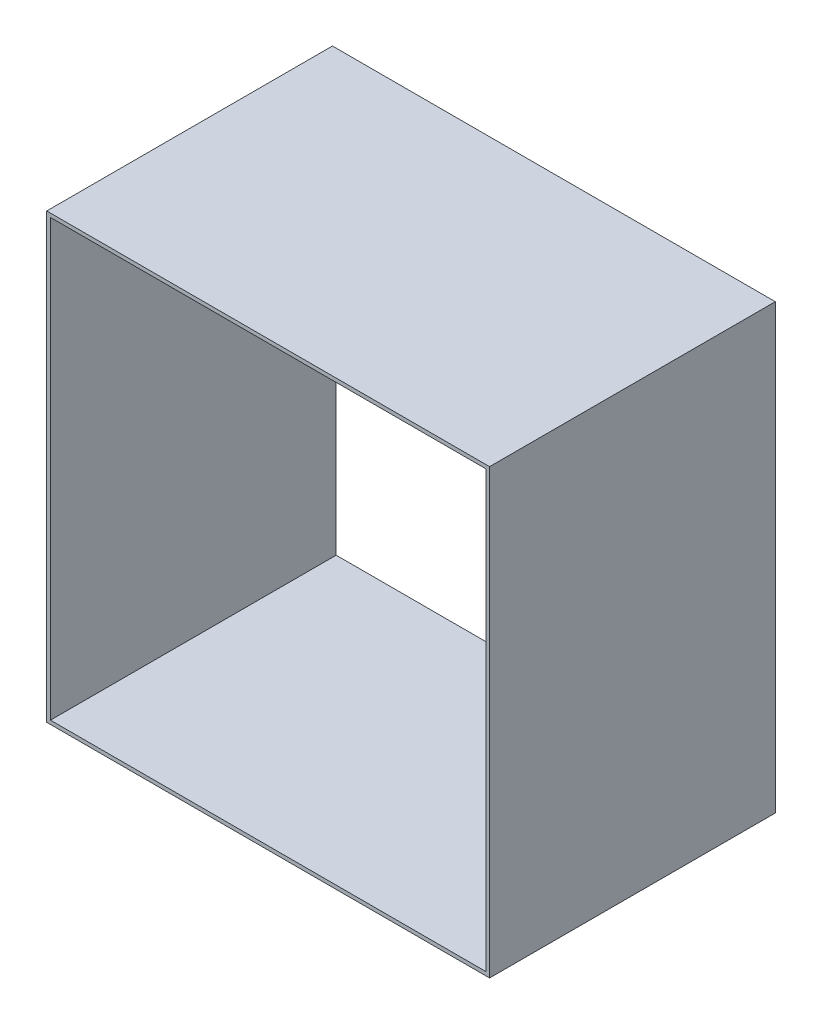
ISO-10303-21;
HEADER;
FILE_DESCRIPTION(('STEP AP214'),'2;1');
FILE_NAME('part.step','',(''),(''),'','','');
FILE_SCHEMA(('AUTOMOTIVE_DESIGN { 1 0 10303 214 1 1 1 1 }'));
ENDSEC;
DATA;
#1=APPLICATION_CONTEXT('core data for automotive mechanical design processes');
#2=APPLICATION_PROTOCOL_DEFINITION('international standard','automotive_design',2000,#1);
#3=PRODUCT_CONTEXT('',#1,'mechanical');
#4=PRODUCT('Part','Part','',(#3));
#5=PRODUCT_RELATED_PRODUCT_CATEGORY('part','',(#4));
#6=PRODUCT_DEFINITION_FORMATION('','',#4);
#7=PRODUCT_DEFINITION_CONTEXT('part definition',#1,'design');
#8=PRODUCT_DEFINITION('design','',#6,#7);
#9=PRODUCT_DEFINITION_SHAPE('','',#8);
#10=(LENGTH_UNIT() NAMED_UNIT(*) SI_UNIT(.MILLI.,.METRE.));
#11=(NAMED_UNIT(*) PLANE_ANGLE_UNIT() SI_UNIT($,.RADIAN.));
#12=(NAMED_UNIT(*) SI_UNIT($,.STERADIAN.) SOLID_ANGLE_UNIT());
#13=UNCERTAINTY_MEASURE_WITH_UNIT(LENGTH_MEASURE(1.E-05),#10,'distance_accuracy_value','');
#14=(GEOMETRIC_REPRESENTATION_CONTEXT(3) GLOBAL_UNCERTAINTY_ASSIGNED_CONTEXT((#13)) GLOBAL_UNIT_ASSIGNED_CONTEXT((#10,
#11,#12)) REPRESENTATION_CONTEXT('',''));
#15=CARTESIAN_POINT('',(0.,0.,0.));
#16=DIRECTION('',(0.,0.,1.));
#17=DIRECTION('',(1.,0.,0.));
#18=AXIS2_PLACEMENT_3D('',#15,#16,#17);
#19=CARTESIAN_POINT('',(0.,0.,420.));
#20=DIRECTION('',(0.,0.,-1.));
#21=DIRECTION('',(-1.,0.,0.));
#22=AXIS2_PLACEMENT_3D('',#19,#20,#21);
#23=PLANE('',#22);
#24=DIRECTION('',(0.,1.,0.));
#25=VECTOR('',#24,1.);
#26=CARTESIAN_POINT('',(325.5,-325.5,420.));
#27=LINE('',#26,#25);
#28=CARTESIAN_POINT('',(325.5,-325.5,420.));
#29=VERTEX_POINT('',#28);
#30=CARTESIAN_POINT('',(325.5,325.5,420.));
#31=VERTEX_POINT('',#30);
#32=EDGE_CURVE('E159',#29,#31,#27,.T.);
#33=ORIENTED_EDGE('',*,*,#32,.T.);
#34=DIRECTION('',(-1.,0.,0.));
#35=VECTOR('',#34,1.);
#36=CARTESIAN_POINT('',(-325.5,325.5,420.));
#37=LINE('',#36,#35);
#38=CARTESIAN_POINT('',(-325.5,325.5,420.));
#39=VERTEX_POINT('',#38);
#40=EDGE_CURVE('E163',#31,#39,#37,.T.);
#41=ORIENTED_EDGE('',*,*,#40,.T.);
#42=DIRECTION('',(0.,-1.,0.));
#43=VECTOR('',#42,1.);
#44=CARTESIAN_POINT('',(-325.5,-325.5,420.));
#45=LINE('',#44,#43);
#46=CARTESIAN_POINT('',(-325.5,-325.5,420.));
#47=VERTEX_POINT('',#46);
#48=EDGE_CURVE('E167',#39,#47,#45,.T.);
#49=ORIENTED_EDGE('',*,*,#48,.T.);
#50=DIRECTION('',(1.,0.,0.));
#51=VECTOR('',#50,1.);
#52=CARTESIAN_POINT('',(-325.5,-325.5,420.));
#53=LINE('',#52,#51);
#54=EDGE_CURVE('E170',#47,#29,#53,.T.);
#55=ORIENTED_EDGE('',*,*,#54,.T.);
#56=EDGE_LOOP('',(#33,#41,#49,#55));
#57=FACE_BOUND('',#56,.T.);
#58=DIRECTION('',(0.,1.,0.));
#59=VECTOR('',#58,1.);
#60=CARTESIAN_POINT('',(320.,-320.,420.));
#61=LINE('',#60,#59);
#62=CARTESIAN_POINT('',(320.,-320.,420.));
#63=VERTEX_POINT('',#62);
#64=CARTESIAN_POINT('',(320.,320.,420.));
#65=VERTEX_POINT('',#64);
#66=EDGE_CURVE('E111',#63,#65,#61,.T.);
#67=ORIENTED_EDGE('',*,*,#66,.F.);
#68=DIRECTION('',(1.,0.,0.));
#69=VECTOR('',#68,1.);
#70=CARTESIAN_POINT('',(-320.,-320.,420.));
#71=LINE('',#70,#69);
#72=CARTESIAN_POINT('',(-320.,-320.,420.));
#73=VERTEX_POINT('',#72);
#74=EDGE_CURVE('E137',#73,#63,#71,.T.);
#75=ORIENTED_EDGE('',*,*,#74,.F.);
#76=DIRECTION('',(0.,-1.,0.));
#77=VECTOR('',#76,1.);
#78=CARTESIAN_POINT('',(-320.,-320.,420.));
#79=LINE('',#78,#77);
#80=CARTESIAN_POINT('',(-320.,320.,420.));
#81=VERTEX_POINT('',#80);
#82=EDGE_CURVE('E133',#81,#73,#79,.T.);
#83=ORIENTED_EDGE('',*,*,#82,.F.);
#84=DIRECTION('',(-1.,0.,0.));
#85=VECTOR('',#84,1.);
#86=CARTESIAN_POINT('',(-320.,320.,420.));
#87=LINE('',#86,#85);
#88=EDGE_CURVE('E120',#65,#81,#87,.T.);
#89=ORIENTED_EDGE('',*,*,#88,.F.);
#90=EDGE_LOOP('',(#67,#75,#83,#89));
#91=FACE_BOUND('',#90,.T.);
#92=ADVANCED_FACE('F45',(#57,#91),#23,.F.);
#93=CARTESIAN_POINT('',(0.,0.,0.));
#94=DIRECTION('',(0.,0.,-1.));
#95=DIRECTION('',(-1.,0.,0.));
#96=AXIS2_PLACEMENT_3D('',#93,#94,#95);
#97=PLANE('',#96);
#98=DIRECTION('',(0.,1.,0.));
#99=VECTOR('',#98,1.);
#100=CARTESIAN_POINT('',(325.5,-325.5,0.));
#101=LINE('',#100,#99);
#102=CARTESIAN_POINT('',(325.5,-325.5,0.));
#103=VERTEX_POINT('',#102);
#104=CARTESIAN_POINT('',(325.5,325.5,0.));
#105=VERTEX_POINT('',#104);
#106=EDGE_CURVE('E129',#103,#105,#101,.T.);
#107=ORIENTED_EDGE('',*,*,#106,.F.);
#108=DIRECTION('',(1.,0.,0.));
#109=VECTOR('',#108,1.);
#110=CARTESIAN_POINT('',(-325.5,-325.5,0.));
#111=LINE('',#110,#109);
#112=CARTESIAN_POINT('',(-325.5,-325.5,0.));
#113=VERTEX_POINT('',#112);
#114=EDGE_CURVE('E164',#113,#103,#111,.T.);
#115=ORIENTED_EDGE('',*,*,#114,.F.);
#116=DIRECTION('',(0.,-1.,0.));
#117=VECTOR('',#116,1.);
#118=CARTESIAN_POINT('',(-325.5,-325.5,0.));
#119=LINE('',#118,#117);
#120=CARTESIAN_POINT('',(-325.5,325.5,0.));
#121=VERTEX_POINT('',#120);
#122=EDGE_CURVE('E180',#121,#113,#119,.T.);
#123=ORIENTED_EDGE('',*,*,#122,.F.);
#124=DIRECTION('',(-1.,0.,0.));
#125=VECTOR('',#124,1.);
#126=CARTESIAN_POINT('',(-325.5,325.5,0.));
#127=LINE('',#126,#125);
#128=EDGE_CURVE('E177',#105,#121,#127,.T.);
#129=ORIENTED_EDGE('',*,*,#128,.F.);
#130=EDGE_LOOP('',(#107,#115,#123,#129));
#131=FACE_BOUND('',#130,.T.);
#132=DIRECTION('',(1.,0.,0.));
#133=VECTOR('',#132,1.);
#134=CARTESIAN_POINT('',(-320.,-320.,0.));
#135=LINE('',#134,#133);
#136=CARTESIAN_POINT('',(-320.,-320.,0.));
#137=VERTEX_POINT('',#136);
#138=CARTESIAN_POINT('',(320.,-320.,0.));
#139=VERTEX_POINT('',#138);
#140=EDGE_CURVE('E121',#137,#139,#135,.T.);
#141=ORIENTED_EDGE('',*,*,#140,.T.);
#142=DIRECTION('',(0.,1.,0.));
#143=VECTOR('',#142,1.);
#144=CARTESIAN_POINT('',(320.,-320.,0.));
#145=LINE('',#144,#143);
#146=CARTESIAN_POINT('',(320.,320.,0.));
#147=VERTEX_POINT('',#146);
#148=EDGE_CURVE('E69',#139,#147,#145,.T.);
#149=ORIENTED_EDGE('',*,*,#148,.T.);
#150=DIRECTION('',(-1.,0.,0.));
#151=VECTOR('',#150,1.);
#152=CARTESIAN_POINT('',(-320.,320.,0.));
#153=LINE('',#152,#151);
#154=CARTESIAN_POINT('',(-320.,320.,0.));
#155=VERTEX_POINT('',#154);
#156=EDGE_CURVE('E127',#147,#155,#153,.T.);
#157=ORIENTED_EDGE('',*,*,#156,.T.);
#158=DIRECTION('',(0.,-1.,0.));
#159=VECTOR('',#158,1.);
#160=CARTESIAN_POINT('',(-320.,-320.,0.));
#161=LINE('',#160,#159);
#162=EDGE_CURVE('E146',#155,#137,#161,.T.);
#163=ORIENTED_EDGE('',*,*,#162,.T.);
#164=EDGE_LOOP('',(#141,#149,#157,#163));
#165=FACE_BOUND('',#164,.T.);
#166=ADVANCED_FACE('F203',(#131,#165),#97,.T.);
#167=CARTESIAN_POINT('',(325.5,-325.5,420.));
#168=DIRECTION('',(-1.,0.,0.));
#169=DIRECTION('',(0.,0.,1.));
#170=AXIS2_PLACEMENT_3D('',#167,#168,#169);
#171=PLANE('',#170);
#172=ORIENTED_EDGE('',*,*,#106,.T.);
#173=DIRECTION('',(0.,0.,-1.));
#174=VECTOR('',#173,1.);
#175=CARTESIAN_POINT('',(325.5,325.5,420.));
#176=LINE('',#175,#174);
#177=EDGE_CURVE('E11',#31,#105,#176,.T.);
#178=ORIENTED_EDGE('',*,*,#177,.F.);
#179=ORIENTED_EDGE('',*,*,#32,.F.);
#180=DIRECTION('',(0.,0.,-1.));
#181=VECTOR('',#180,1.);
#182=CARTESIAN_POINT('',(325.5,-325.5,420.));
#183=LINE('',#182,#181);
#184=EDGE_CURVE('E173',#29,#103,#183,.T.);
#185=ORIENTED_EDGE('',*,*,#184,.T.);
#186=EDGE_LOOP('',(#172,#178,#179,#185));
#187=FACE_BOUND('',#186,.T.);
#188=ADVANCED_FACE('F47',(#187),#171,.F.);
#189=CARTESIAN_POINT('',(-325.5,325.5,420.));
#190=DIRECTION('',(0.,-1.,0.));
#191=DIRECTION('',(0.,0.,-1.));
#192=AXIS2_PLACEMENT_3D('',#189,#190,#191);
#193=PLANE('',#192);
#194=ORIENTED_EDGE('',*,*,#128,.T.);
#195=DIRECTION('',(0.,0.,-1.));
#196=VECTOR('',#195,1.);
#197=CARTESIAN_POINT('',(-325.5,325.5,420.));
#198=LINE('',#197,#196);
#199=EDGE_CURVE('E54',#39,#121,#198,.T.);
#200=ORIENTED_EDGE('',*,*,#199,.F.);
#201=ORIENTED_EDGE('',*,*,#40,.F.);
#202=ORIENTED_EDGE('',*,*,#177,.T.);
#203=EDGE_LOOP('',(#194,#200,#201,#202));
#204=FACE_BOUND('',#203,.T.);
#205=ADVANCED_FACE('F213',(#204),#193,.F.);
#206=CARTESIAN_POINT('',(-325.5,-325.5,420.));
#207=DIRECTION('',(1.,0.,0.));
#208=DIRECTION('',(0.,0.,-1.));
#209=AXIS2_PLACEMENT_3D('',#206,#207,#208);
#210=PLANE('',#209);
#211=ORIENTED_EDGE('',*,*,#122,.T.);
#212=DIRECTION('',(0.,0.,-1.));
#213=VECTOR('',#212,1.);
#214=CARTESIAN_POINT('',(-325.5,-325.5,420.));
#215=LINE('',#214,#213);
#216=EDGE_CURVE('E188',#47,#113,#215,.T.);
#217=ORIENTED_EDGE('',*,*,#216,.F.);
#218=ORIENTED_EDGE('',*,*,#48,.F.);
#219=ORIENTED_EDGE('',*,*,#199,.T.);
#220=EDGE_LOOP('',(#211,#217,#218,#219));
#221=FACE_BOUND('',#220,.T.);
#222=ADVANCED_FACE('F197',(#221),#210,.F.);
#223=CARTESIAN_POINT('',(-325.5,-325.5,420.));
#224=DIRECTION('',(0.,1.,0.));
#225=DIRECTION('',(0.,0.,1.));
#226=AXIS2_PLACEMENT_3D('',#223,#224,#225);
#227=PLANE('',#226);
#228=ORIENTED_EDGE('',*,*,#114,.T.);
#229=ORIENTED_EDGE('',*,*,#184,.F.);
#230=ORIENTED_EDGE('',*,*,#54,.F.);
#231=ORIENTED_EDGE('',*,*,#216,.T.);
#232=EDGE_LOOP('',(#228,#229,#230,#231));
#233=FACE_BOUND('',#232,.T.);
#234=ADVANCED_FACE('F207',(#233),#227,.F.);
#235=CARTESIAN_POINT('',(320.,-320.,420.));
#236=DIRECTION('',(-1.,0.,0.));
#237=DIRECTION('',(0.,0.,1.));
#238=AXIS2_PLACEMENT_3D('',#235,#236,#237);
#239=PLANE('',#238);
#240=ORIENTED_EDGE('',*,*,#148,.F.);
#241=DIRECTION('',(0.,0.,-1.));
#242=VECTOR('',#241,1.);
#243=CARTESIAN_POINT('',(320.,-320.,420.));
#244=LINE('',#243,#242);
#245=EDGE_CURVE('E115',#63,#139,#244,.T.);
#246=ORIENTED_EDGE('',*,*,#245,.F.);
#247=ORIENTED_EDGE('',*,*,#66,.T.);
#248=DIRECTION('',(0.,0.,-1.));
#249=VECTOR('',#248,1.);
#250=CARTESIAN_POINT('',(320.,320.,420.));
#251=LINE('',#250,#249);
#252=EDGE_CURVE('E114',#65,#147,#251,.T.);
#253=ORIENTED_EDGE('',*,*,#252,.T.);
#254=EDGE_LOOP('',(#240,#246,#247,#253));
#255=FACE_BOUND('',#254,.T.);
#256=ADVANCED_FACE('F113',(#255),#239,.T.);
#257=CARTESIAN_POINT('',(-320.,320.,420.));
#258=DIRECTION('',(0.,-1.,0.));
#259=DIRECTION('',(0.,0.,-1.));
#260=AXIS2_PLACEMENT_3D('',#257,#258,#259);
#261=PLANE('',#260);
#262=ORIENTED_EDGE('',*,*,#156,.F.);
#263=ORIENTED_EDGE('',*,*,#252,.F.);
#264=ORIENTED_EDGE('',*,*,#88,.T.);
#265=DIRECTION('',(0.,0.,-1.));
#266=VECTOR('',#265,1.);
#267=CARTESIAN_POINT('',(-320.,320.,420.));
#268=LINE('',#267,#266);
#269=EDGE_CURVE('E130',#81,#155,#268,.T.);
#270=ORIENTED_EDGE('',*,*,#269,.T.);
#271=EDGE_LOOP('',(#262,#263,#264,#270));
#272=FACE_BOUND('',#271,.T.);
#273=ADVANCED_FACE('F124',(#272),#261,.T.);
#274=CARTESIAN_POINT('',(-320.,-320.,420.));
#275=DIRECTION('',(1.,0.,0.));
#276=DIRECTION('',(0.,0.,-1.));
#277=AXIS2_PLACEMENT_3D('',#274,#275,#276);
#278=PLANE('',#277);
#279=ORIENTED_EDGE('',*,*,#162,.F.);
#280=ORIENTED_EDGE('',*,*,#269,.F.);
#281=ORIENTED_EDGE('',*,*,#82,.T.);
#282=DIRECTION('',(0.,0.,-1.));
#283=VECTOR('',#282,1.);
#284=CARTESIAN_POINT('',(-320.,-320.,420.));
#285=LINE('',#284,#283);
#286=EDGE_CURVE('E61',#73,#137,#285,.T.);
#287=ORIENTED_EDGE('',*,*,#286,.T.);
#288=EDGE_LOOP('',(#279,#280,#281,#287));
#289=FACE_BOUND('',#288,.T.);
#290=ADVANCED_FACE('F236',(#289),#278,.T.);
#291=CARTESIAN_POINT('',(-320.,-320.,420.));
#292=DIRECTION('',(0.,1.,0.));
#293=DIRECTION('',(-1.,0.,0.));
#294=AXIS2_PLACEMENT_3D('',#291,#292,#293);
#295=PLANE('',#294);
#296=ORIENTED_EDGE('',*,*,#140,.F.);
#297=ORIENTED_EDGE('',*,*,#286,.F.);
#298=ORIENTED_EDGE('',*,*,#74,.T.);
#299=ORIENTED_EDGE('',*,*,#245,.T.);
#300=EDGE_LOOP('',(#296,#297,#298,#299));
#301=FACE_BOUND('',#300,.T.);
#302=ADVANCED_FACE('F240',(#301),#295,.T.);
#303=CLOSED_SHELL('',(#92,#166,#188,#205,#222,#234,#256,#273,#290,#302));
#304=MANIFOLD_SOLID_BREP('B2',#303);
#305=ADVANCED_BREP_SHAPE_REPRESENTATION('',(#18,#304),#14);
#306=SHAPE_DEFINITION_REPRESENTATION(#9,#305);
ENDSEC;
END-ISO-10303-21;
